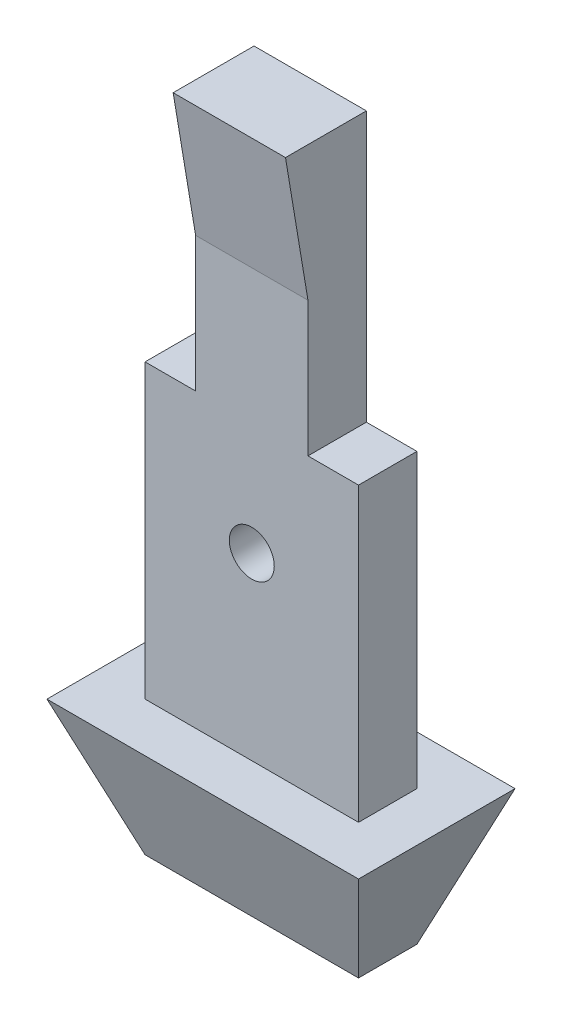
ISO-10303-21;
HEADER;
FILE_DESCRIPTION(('STEP AP214'),'2;1');
FILE_NAME('part.step','',(''),(''),'','','');
FILE_SCHEMA(('AUTOMOTIVE_DESIGN { 1 0 10303 214 1 1 1 1 }'));
ENDSEC;
DATA;
#1=APPLICATION_CONTEXT('core data for automotive mechanical design processes');
#2=APPLICATION_PROTOCOL_DEFINITION('international standard','automotive_design',2000,#1);
#3=PRODUCT_CONTEXT('',#1,'mechanical');
#4=PRODUCT('Part','Part','',(#3));
#5=PRODUCT_RELATED_PRODUCT_CATEGORY('part','',(#4));
#6=PRODUCT_DEFINITION_FORMATION('','',#4);
#7=PRODUCT_DEFINITION_CONTEXT('part definition',#1,'design');
#8=PRODUCT_DEFINITION('design','',#6,#7);
#9=PRODUCT_DEFINITION_SHAPE('','',#8);
#10=(LENGTH_UNIT() NAMED_UNIT(*) SI_UNIT(.MILLI.,.METRE.));
#11=(NAMED_UNIT(*) PLANE_ANGLE_UNIT() SI_UNIT($,.RADIAN.));
#12=(NAMED_UNIT(*) SI_UNIT($,.STERADIAN.) SOLID_ANGLE_UNIT());
#13=UNCERTAINTY_MEASURE_WITH_UNIT(LENGTH_MEASURE(1.E-05),#10,'distance_accuracy_value','');
#14=(GEOMETRIC_REPRESENTATION_CONTEXT(3) GLOBAL_UNCERTAINTY_ASSIGNED_CONTEXT((#13)) GLOBAL_UNIT_ASSIGNED_CONTEXT((#10,
#11,#12)) REPRESENTATION_CONTEXT('',''));
#15=CARTESIAN_POINT('',(0.,0.,0.));
#16=DIRECTION('',(0.,0.,1.));
#17=DIRECTION('',(1.,0.,0.));
#18=AXIS2_PLACEMENT_3D('',#15,#16,#17);
#19=CARTESIAN_POINT('',(0.,0.,2.6));
#20=DIRECTION('',(0.,0.,1.));
#21=DIRECTION('',(1.,0.,0.));
#22=AXIS2_PLACEMENT_3D('',#19,#20,#21);
#23=PLANE('',#22);
#24=DIRECTION('',(1.,0.,0.));
#25=VECTOR('',#24,1.);
#26=CARTESIAN_POINT('',(-8.58276253029822,25.,2.6));
#27=LINE('',#26,#25);
#28=CARTESIAN_POINT('',(-2.5,25.,2.6));
#29=VERTEX_POINT('',#28);
#30=CARTESIAN_POINT('',(2.5,25.,2.6));
#31=VERTEX_POINT('',#30);
#32=EDGE_CURVE('E146',#29,#31,#27,.T.);
#33=ORIENTED_EDGE('',*,*,#32,.F.);
#34=DIRECTION('',(0.,-1.,0.));
#35=VECTOR('',#34,1.);
#36=CARTESIAN_POINT('',(-2.5,31.,2.6));
#37=LINE('',#36,#35);
#38=CARTESIAN_POINT('',(-2.5,19.,2.6));
#39=VERTEX_POINT('',#38);
#40=EDGE_CURVE('E192',#29,#39,#37,.T.);
#41=ORIENTED_EDGE('',*,*,#40,.T.);
#42=DIRECTION('',(-1.,0.,0.));
#43=VECTOR('',#42,1.);
#44=CARTESIAN_POINT('',(-2.5,19.,2.6));
#45=LINE('',#44,#43);
#46=CARTESIAN_POINT('',(-4.75,19.,2.6));
#47=VERTEX_POINT('',#46);
#48=EDGE_CURVE('E195',#39,#47,#45,.T.);
#49=ORIENTED_EDGE('',*,*,#48,.T.);
#50=DIRECTION('',(0.,-1.,0.));
#51=VECTOR('',#50,1.);
#52=CARTESIAN_POINT('',(-4.75,19.,2.6));
#53=LINE('',#52,#51);
#54=CARTESIAN_POINT('',(-4.75,6.,2.6));
#55=VERTEX_POINT('',#54);
#56=EDGE_CURVE('E197',#47,#55,#53,.T.);
#57=ORIENTED_EDGE('',*,*,#56,.T.);
#58=DIRECTION('',(1.,0.,0.));
#59=VECTOR('',#58,1.);
#60=CARTESIAN_POINT('',(0.,6.,2.6));
#61=LINE('',#60,#59);
#62=CARTESIAN_POINT('',(4.75,6.,2.6));
#63=VERTEX_POINT('',#62);
#64=EDGE_CURVE('E181',#55,#63,#61,.T.);
#65=ORIENTED_EDGE('',*,*,#64,.T.);
#66=DIRECTION('',(0.,1.,0.));
#67=VECTOR('',#66,1.);
#68=CARTESIAN_POINT('',(4.75,19.,2.6));
#69=LINE('',#68,#67);
#70=CARTESIAN_POINT('',(4.75,19.,2.6));
#71=VERTEX_POINT('',#70);
#72=EDGE_CURVE('E202',#63,#71,#69,.T.);
#73=ORIENTED_EDGE('',*,*,#72,.T.);
#74=DIRECTION('',(-1.,0.,0.));
#75=VECTOR('',#74,1.);
#76=CARTESIAN_POINT('',(2.5,19.,2.6));
#77=LINE('',#76,#75);
#78=CARTESIAN_POINT('',(2.5,19.,2.6));
#79=VERTEX_POINT('',#78);
#80=EDGE_CURVE('E204',#71,#79,#77,.T.);
#81=ORIENTED_EDGE('',*,*,#80,.T.);
#82=DIRECTION('',(0.,1.,0.));
#83=VECTOR('',#82,1.);
#84=CARTESIAN_POINT('',(2.5,31.,2.6));
#85=LINE('',#84,#83);
#86=EDGE_CURVE('E47',#79,#31,#85,.T.);
#87=ORIENTED_EDGE('',*,*,#86,.T.);
#88=EDGE_LOOP('',(#33,#41,#49,#57,#65,#73,#81,#87));
#89=FACE_BOUND('',#88,.T.);
#90=CARTESIAN_POINT('',(0.,14.,2.6));
#91=DIRECTION('',(0.,0.,1.));
#92=DIRECTION('',(1.,0.,0.));
#93=AXIS2_PLACEMENT_3D('',#90,#91,#92);
#94=CIRCLE('',#93,1.);
#95=CARTESIAN_POINT('',(1.,14.,2.6));
#96=VERTEX_POINT('',#95);
#97=EDGE_CURVE('E186',#96,#96,#94,.T.);
#98=ORIENTED_EDGE('',*,*,#97,.F.);
#99=EDGE_LOOP('',(#98));
#100=FACE_BOUND('',#99,.T.);
#101=ADVANCED_FACE('F32',(#89,#100),#23,.T.);
#102=CARTESIAN_POINT('',(0.,0.,0.));
#103=DIRECTION('',(0.,0.,1.));
#104=DIRECTION('',(1.,0.,0.));
#105=AXIS2_PLACEMENT_3D('',#102,#103,#104);
#106=PLANE('',#105);
#107=CARTESIAN_POINT('',(0.,14.,0.));
#108=DIRECTION('',(0.,0.,1.));
#109=DIRECTION('',(1.,0.,0.));
#110=AXIS2_PLACEMENT_3D('',#107,#108,#109);
#111=CIRCLE('',#110,1.);
#112=CARTESIAN_POINT('',(1.,14.,0.));
#113=VERTEX_POINT('',#112);
#114=EDGE_CURVE('E185',#113,#113,#111,.T.);
#115=ORIENTED_EDGE('',*,*,#114,.T.);
#116=EDGE_LOOP('',(#115));
#117=FACE_BOUND('',#116,.T.);
#118=DIRECTION('',(1.,0.,0.));
#119=VECTOR('',#118,1.);
#120=CARTESIAN_POINT('',(0.,6.,0.));
#121=LINE('',#120,#119);
#122=CARTESIAN_POINT('',(-4.75,6.,0.));
#123=VERTEX_POINT('',#122);
#124=CARTESIAN_POINT('',(4.75,6.,0.));
#125=VERTEX_POINT('',#124);
#126=EDGE_CURVE('E157',#123,#125,#121,.T.);
#127=ORIENTED_EDGE('',*,*,#126,.F.);
#128=DIRECTION('',(0.,-1.,0.));
#129=VECTOR('',#128,1.);
#130=CARTESIAN_POINT('',(-4.75,19.,0.));
#131=LINE('',#130,#129);
#132=CARTESIAN_POINT('',(-4.75,19.,0.));
#133=VERTEX_POINT('',#132);
#134=EDGE_CURVE('E214',#133,#123,#131,.T.);
#135=ORIENTED_EDGE('',*,*,#134,.F.);
#136=DIRECTION('',(-1.,0.,0.));
#137=VECTOR('',#136,1.);
#138=CARTESIAN_POINT('',(-2.5,19.,0.));
#139=LINE('',#138,#137);
#140=CARTESIAN_POINT('',(-2.5,19.,0.));
#141=VERTEX_POINT('',#140);
#142=EDGE_CURVE('E212',#141,#133,#139,.T.);
#143=ORIENTED_EDGE('',*,*,#142,.F.);
#144=DIRECTION('',(0.,-1.,0.));
#145=VECTOR('',#144,1.);
#146=CARTESIAN_POINT('',(-2.5,31.,0.));
#147=LINE('',#146,#145);
#148=CARTESIAN_POINT('',(-2.5,31.,0.));
#149=VERTEX_POINT('',#148);
#150=EDGE_CURVE('E210',#149,#141,#147,.T.);
#151=ORIENTED_EDGE('',*,*,#150,.F.);
#152=DIRECTION('',(-1.,0.,0.));
#153=VECTOR('',#152,1.);
#154=CARTESIAN_POINT('',(-2.5,31.,0.));
#155=LINE('',#154,#153);
#156=CARTESIAN_POINT('',(2.5,31.,0.));
#157=VERTEX_POINT('',#156);
#158=EDGE_CURVE('E208',#157,#149,#155,.T.);
#159=ORIENTED_EDGE('',*,*,#158,.F.);
#160=DIRECTION('',(0.,1.,0.));
#161=VECTOR('',#160,1.);
#162=CARTESIAN_POINT('',(2.5,31.,0.));
#163=LINE('',#162,#161);
#164=CARTESIAN_POINT('',(2.5,19.,0.));
#165=VERTEX_POINT('',#164);
#166=EDGE_CURVE('E136',#165,#157,#163,.T.);
#167=ORIENTED_EDGE('',*,*,#166,.F.);
#168=DIRECTION('',(-1.,0.,0.));
#169=VECTOR('',#168,1.);
#170=CARTESIAN_POINT('',(2.5,19.,0.));
#171=LINE('',#170,#169);
#172=CARTESIAN_POINT('',(4.75,19.,0.));
#173=VERTEX_POINT('',#172);
#174=EDGE_CURVE('E193',#173,#165,#171,.T.);
#175=ORIENTED_EDGE('',*,*,#174,.F.);
#176=DIRECTION('',(0.,1.,0.));
#177=VECTOR('',#176,1.);
#178=CARTESIAN_POINT('',(4.75,19.,0.));
#179=LINE('',#178,#177);
#180=EDGE_CURVE('E218',#125,#173,#179,.T.);
#181=ORIENTED_EDGE('',*,*,#180,.F.);
#182=EDGE_LOOP('',(#127,#135,#143,#151,#159,#167,#175,#181));
#183=FACE_BOUND('',#182,.T.);
#184=ADVANCED_FACE('F242',(#117,#183),#106,.F.);
#185=CARTESIAN_POINT('',(-4.75,19.,2.6));
#186=DIRECTION('',(1.,0.,0.));
#187=DIRECTION('',(0.,1.,0.));
#188=AXIS2_PLACEMENT_3D('',#185,#186,#187);
#189=PLANE('',#188);
#190=DIRECTION('',(0.,0.,-1.));
#191=VECTOR('',#190,1.);
#192=CARTESIAN_POINT('',(-4.75,6.,2.6));
#193=LINE('',#192,#191);
#194=EDGE_CURVE('E55',#55,#123,#193,.T.);
#195=ORIENTED_EDGE('',*,*,#194,.F.);
#196=ORIENTED_EDGE('',*,*,#56,.F.);
#197=DIRECTION('',(0.,0.,-1.));
#198=VECTOR('',#197,1.);
#199=CARTESIAN_POINT('',(-4.75,19.,2.6));
#200=LINE('',#199,#198);
#201=EDGE_CURVE('E230',#47,#133,#200,.T.);
#202=ORIENTED_EDGE('',*,*,#201,.T.);
#203=ORIENTED_EDGE('',*,*,#134,.T.);
#204=EDGE_LOOP('',(#195,#196,#202,#203));
#205=FACE_BOUND('',#204,.T.);
#206=ADVANCED_FACE('F248',(#205),#189,.F.);
#207=CARTESIAN_POINT('',(4.75,19.,2.6));
#208=DIRECTION('',(-1.,0.,0.));
#209=DIRECTION('',(0.,-1.,0.));
#210=AXIS2_PLACEMENT_3D('',#207,#208,#209);
#211=PLANE('',#210);
#212=DIRECTION('',(0.,0.,1.));
#213=VECTOR('',#212,1.);
#214=CARTESIAN_POINT('',(4.75,6.,2.6));
#215=LINE('',#214,#213);
#216=EDGE_CURVE('E11',#125,#63,#215,.T.);
#217=ORIENTED_EDGE('',*,*,#216,.F.);
#218=ORIENTED_EDGE('',*,*,#180,.T.);
#219=DIRECTION('',(0.,0.,-1.));
#220=VECTOR('',#219,1.);
#221=CARTESIAN_POINT('',(4.75,19.,2.6));
#222=LINE('',#221,#220);
#223=EDGE_CURVE('E222',#71,#173,#222,.T.);
#224=ORIENTED_EDGE('',*,*,#223,.F.);
#225=ORIENTED_EDGE('',*,*,#72,.F.);
#226=EDGE_LOOP('',(#217,#218,#224,#225));
#227=FACE_BOUND('',#226,.T.);
#228=ADVANCED_FACE('F255',(#227),#211,.F.);
#229=CARTESIAN_POINT('',(2.5,31.,2.6));
#230=DIRECTION('',(-1.,0.,0.));
#231=DIRECTION('',(0.,-1.,0.));
#232=AXIS2_PLACEMENT_3D('',#229,#230,#231);
#233=PLANE('',#232);
#234=ORIENTED_EDGE('',*,*,#166,.T.);
#235=DIRECTION('',(0.,0.,-1.));
#236=VECTOR('',#235,1.);
#237=CARTESIAN_POINT('',(2.5,31.,2.6));
#238=LINE('',#237,#236);
#239=CARTESIAN_POINT('',(2.49999999999999,31.,3.6));
#240=VERTEX_POINT('',#239);
#241=EDGE_CURVE('E40',#240,#157,#238,.T.);
#242=ORIENTED_EDGE('',*,*,#241,.F.);
#243=DIRECTION('',(0.,-0.986393923832144,-0.164398987305357));
#244=VECTOR('',#243,1.);
#245=CARTESIAN_POINT('',(2.49999999999999,31.,3.6));
#246=LINE('',#245,#244);
#247=EDGE_CURVE('E133',#240,#31,#246,.T.);
#248=ORIENTED_EDGE('',*,*,#247,.T.);
#249=ORIENTED_EDGE('',*,*,#86,.F.);
#250=DIRECTION('',(0.,0.,-1.));
#251=VECTOR('',#250,1.);
#252=CARTESIAN_POINT('',(2.5,19.,2.6));
#253=LINE('',#252,#251);
#254=EDGE_CURVE('E206',#79,#165,#253,.T.);
#255=ORIENTED_EDGE('',*,*,#254,.T.);
#256=EDGE_LOOP('',(#234,#242,#248,#249,#255));
#257=FACE_BOUND('',#256,.T.);
#258=ADVANCED_FACE('F34',(#257),#233,.F.);
#259=CARTESIAN_POINT('',(-2.5,31.,2.6));
#260=DIRECTION('',(0.,-1.,0.));
#261=DIRECTION('',(0.,0.,-1.));
#262=AXIS2_PLACEMENT_3D('',#259,#260,#261);
#263=PLANE('',#262);
#264=ORIENTED_EDGE('',*,*,#158,.T.);
#265=DIRECTION('',(0.,0.,-1.));
#266=VECTOR('',#265,1.);
#267=CARTESIAN_POINT('',(-2.5,31.,2.6));
#268=LINE('',#267,#266);
#269=CARTESIAN_POINT('',(-2.5,31.,3.6));
#270=VERTEX_POINT('',#269);
#271=EDGE_CURVE('E138',#270,#149,#268,.T.);
#272=ORIENTED_EDGE('',*,*,#271,.F.);
#273=DIRECTION('',(1.,0.,0.));
#274=VECTOR('',#273,1.);
#275=CARTESIAN_POINT('',(-8.58276253029822,31.,3.6));
#276=LINE('',#275,#274);
#277=EDGE_CURVE('E140',#270,#240,#276,.T.);
#278=ORIENTED_EDGE('',*,*,#277,.T.);
#279=ORIENTED_EDGE('',*,*,#241,.T.);
#280=EDGE_LOOP('',(#264,#272,#278,#279));
#281=FACE_BOUND('',#280,.T.);
#282=ADVANCED_FACE('F141',(#281),#263,.F.);
#283=CARTESIAN_POINT('',(-2.5,31.,2.6));
#284=DIRECTION('',(1.,0.,0.));
#285=DIRECTION('',(0.,1.,0.));
#286=AXIS2_PLACEMENT_3D('',#283,#284,#285);
#287=PLANE('',#286);
#288=ORIENTED_EDGE('',*,*,#150,.T.);
#289=DIRECTION('',(0.,0.,-1.));
#290=VECTOR('',#289,1.);
#291=CARTESIAN_POINT('',(-2.5,19.,2.6));
#292=LINE('',#291,#290);
#293=EDGE_CURVE('E233',#39,#141,#292,.T.);
#294=ORIENTED_EDGE('',*,*,#293,.F.);
#295=ORIENTED_EDGE('',*,*,#40,.F.);
#296=DIRECTION('',(0.,0.986393923832144,0.164398987305357));
#297=VECTOR('',#296,1.);
#298=CARTESIAN_POINT('',(-2.5,31.,3.6));
#299=LINE('',#298,#297);
#300=EDGE_CURVE('E152',#29,#270,#299,.T.);
#301=ORIENTED_EDGE('',*,*,#300,.T.);
#302=ORIENTED_EDGE('',*,*,#271,.T.);
#303=EDGE_LOOP('',(#288,#294,#295,#301,#302));
#304=FACE_BOUND('',#303,.T.);
#305=ADVANCED_FACE('F238',(#304),#287,.F.);
#306=CARTESIAN_POINT('',(-2.5,19.,2.6));
#307=DIRECTION('',(0.,-1.,0.));
#308=DIRECTION('',(0.,0.,-1.));
#309=AXIS2_PLACEMENT_3D('',#306,#307,#308);
#310=PLANE('',#309);
#311=ORIENTED_EDGE('',*,*,#142,.T.);
#312=ORIENTED_EDGE('',*,*,#201,.F.);
#313=ORIENTED_EDGE('',*,*,#48,.F.);
#314=ORIENTED_EDGE('',*,*,#293,.T.);
#315=EDGE_LOOP('',(#311,#312,#313,#314));
#316=FACE_BOUND('',#315,.T.);
#317=ADVANCED_FACE('F246',(#316),#310,.F.);
#318=CARTESIAN_POINT('',(2.5,19.,2.6));
#319=DIRECTION('',(0.,-1.,0.));
#320=DIRECTION('',(0.,0.,-1.));
#321=AXIS2_PLACEMENT_3D('',#318,#319,#320);
#322=PLANE('',#321);
#323=ORIENTED_EDGE('',*,*,#174,.T.);
#324=ORIENTED_EDGE('',*,*,#254,.F.);
#325=ORIENTED_EDGE('',*,*,#80,.F.);
#326=ORIENTED_EDGE('',*,*,#223,.T.);
#327=EDGE_LOOP('',(#323,#324,#325,#326));
#328=FACE_BOUND('',#327,.T.);
#329=ADVANCED_FACE('F260',(#328),#322,.F.);
#330=CARTESIAN_POINT('',(0.,14.,2.6));
#331=DIRECTION('',(0.,0.,-1.));
#332=DIRECTION('',(-1.,0.,0.));
#333=AXIS2_PLACEMENT_3D('',#330,#331,#332);
#334=CYLINDRICAL_SURFACE('',#333,1.);
#335=ORIENTED_EDGE('',*,*,#97,.T.);
#336=EDGE_LOOP('',(#335));
#337=FACE_BOUND('',#336,.T.);
#338=ORIENTED_EDGE('',*,*,#114,.F.);
#339=EDGE_LOOP('',(#338));
#340=FACE_BOUND('',#339,.T.);
#341=ADVANCED_FACE('F263',(#337,#340),#334,.F.);
#342=CARTESIAN_POINT('',(0.,6.,0.));
#343=DIRECTION('',(0.,-1.,0.));
#344=DIRECTION('',(0.,0.,-1.));
#345=AXIS2_PLACEMENT_3D('',#342,#343,#344);
#346=PLANE('',#345);
#347=DIRECTION('',(0.,0.,-1.));
#348=VECTOR('',#347,1.);
#349=CARTESIAN_POINT('',(-6.93382140559722,6.,0.));
#350=LINE('',#349,#348);
#351=CARTESIAN_POINT('',(-6.93382140559722,6.,4.78382140559722));
#352=VERTEX_POINT('',#351);
#353=CARTESIAN_POINT('',(-6.93382140559722,6.,-2.18382140559722));
#354=VERTEX_POINT('',#353);
#355=EDGE_CURVE('E168',#352,#354,#350,.T.);
#356=ORIENTED_EDGE('',*,*,#355,.F.);
#357=DIRECTION('',(-1.,0.,0.));
#358=VECTOR('',#357,1.);
#359=CARTESIAN_POINT('',(0.,6.,4.78382140559722));
#360=LINE('',#359,#358);
#361=CARTESIAN_POINT('',(6.93382140559722,6.,4.78382140559722));
#362=VERTEX_POINT('',#361);
#363=EDGE_CURVE('E163',#362,#352,#360,.T.);
#364=ORIENTED_EDGE('',*,*,#363,.F.);
#365=DIRECTION('',(0.,0.,1.));
#366=VECTOR('',#365,1.);
#367=CARTESIAN_POINT('',(6.93382140559722,6.,0.));
#368=LINE('',#367,#366);
#369=CARTESIAN_POINT('',(6.93382140559722,6.,-2.18382140559722));
#370=VERTEX_POINT('',#369);
#371=EDGE_CURVE('E174',#370,#362,#368,.T.);
#372=ORIENTED_EDGE('',*,*,#371,.F.);
#373=DIRECTION('',(1.,0.,0.));
#374=VECTOR('',#373,1.);
#375=CARTESIAN_POINT('',(0.,6.,-2.18382140559722));
#376=LINE('',#375,#374);
#377=EDGE_CURVE('E171',#354,#370,#376,.T.);
#378=ORIENTED_EDGE('',*,*,#377,.F.);
#379=EDGE_LOOP('',(#356,#364,#372,#378));
#380=FACE_BOUND('',#379,.T.);
#381=ORIENTED_EDGE('',*,*,#64,.F.);
#382=ORIENTED_EDGE('',*,*,#194,.T.);
#383=ORIENTED_EDGE('',*,*,#126,.T.);
#384=ORIENTED_EDGE('',*,*,#216,.T.);
#385=EDGE_LOOP('',(#381,#382,#383,#384));
#386=FACE_BOUND('',#385,.T.);
#387=ADVANCED_FACE('F252',(#380,#386),#346,.F.);
#388=CARTESIAN_POINT('',(-4.75,0.,2.6));
#389=DIRECTION('',(-0.939692620785908,-0.342020143325669,0.));
#390=DIRECTION('',(0.342020143325669,-0.939692620785908,0.));
#391=AXIS2_PLACEMENT_3D('',#388,#389,#390);
#392=PLANE('',#391);
#393=DIRECTION('',(0.,0.,-1.));
#394=VECTOR('',#393,1.);
#395=CARTESIAN_POINT('',(-4.75,0.,2.6));
#396=LINE('',#395,#394);
#397=CARTESIAN_POINT('',(-4.75,0.,2.6));
#398=VERTEX_POINT('',#397);
#399=CARTESIAN_POINT('',(-4.75,0.,0.));
#400=VERTEX_POINT('',#399);
#401=EDGE_CURVE('E228',#398,#400,#396,.T.);
#402=ORIENTED_EDGE('',*,*,#401,.F.);
#403=DIRECTION('',(0.323615577118185,-0.889126490715988,-0.323615577118185));
#404=VECTOR('',#403,1.);
#405=CARTESIAN_POINT('',(-3.75509310334141,-2.73348423302915,1.60509310334141));
#406=LINE('',#405,#404);
#407=EDGE_CURVE('E154',#352,#398,#406,.T.);
#408=ORIENTED_EDGE('',*,*,#407,.F.);
#409=ORIENTED_EDGE('',*,*,#355,.T.);
#410=DIRECTION('',(0.323615577118185,-0.889126490715988,0.323615577118185));
#411=VECTOR('',#410,1.);
#412=CARTESIAN_POINT('',(-4.47770969144081,-0.748111474302715,0.272290308559194));
#413=LINE('',#412,#411);
#414=EDGE_CURVE('E159',#354,#400,#413,.T.);
#415=ORIENTED_EDGE('',*,*,#414,.T.);
#416=EDGE_LOOP('',(#402,#408,#409,#415));
#417=FACE_BOUND('',#416,.T.);
#418=ADVANCED_FACE('F285',(#417),#392,.T.);
#419=CARTESIAN_POINT('',(4.75,0.,2.6));
#420=DIRECTION('',(0.,-0.342020143325669,0.939692620785908));
#421=DIRECTION('',(0.,-0.939692620785908,-0.342020143325669));
#422=AXIS2_PLACEMENT_3D('',#419,#420,#421);
#423=PLANE('',#422);
#424=DIRECTION('',(1.,0.,0.));
#425=VECTOR('',#424,1.);
#426=CARTESIAN_POINT('',(4.75,0.,2.6));
#427=LINE('',#426,#425);
#428=CARTESIAN_POINT('',(4.75,0.,2.6));
#429=VERTEX_POINT('',#428);
#430=EDGE_CURVE('E199',#398,#429,#427,.T.);
#431=ORIENTED_EDGE('',*,*,#430,.T.);
#432=DIRECTION('',(-0.323615577118185,-0.889126490715988,-0.323615577118185));
#433=VECTOR('',#432,1.);
#434=CARTESIAN_POINT('',(4.47770969144081,-0.748111474302715,2.32770969144081));
#435=LINE('',#434,#433);
#436=EDGE_CURVE('E158',#362,#429,#435,.T.);
#437=ORIENTED_EDGE('',*,*,#436,.F.);
#438=ORIENTED_EDGE('',*,*,#363,.T.);
#439=ORIENTED_EDGE('',*,*,#407,.T.);
#440=EDGE_LOOP('',(#431,#437,#438,#439));
#441=FACE_BOUND('',#440,.T.);
#442=ADVANCED_FACE('F281',(#441),#423,.T.);
#443=CARTESIAN_POINT('',(4.75,0.,0.));
#444=DIRECTION('',(0.939692620785908,-0.342020143325669,0.));
#445=DIRECTION('',(0.342020143325669,0.939692620785908,0.));
#446=AXIS2_PLACEMENT_3D('',#443,#444,#445);
#447=PLANE('',#446);
#448=DIRECTION('',(0.,0.,-1.));
#449=VECTOR('',#448,1.);
#450=CARTESIAN_POINT('',(4.75,0.,2.6));
#451=LINE('',#450,#449);
#452=CARTESIAN_POINT('',(4.75,0.,0.));
#453=VERTEX_POINT('',#452);
#454=EDGE_CURVE('E225',#429,#453,#451,.T.);
#455=ORIENTED_EDGE('',*,*,#454,.T.);
#456=DIRECTION('',(-0.323615577118185,-0.889126490715988,0.323615577118185));
#457=VECTOR('',#456,1.);
#458=CARTESIAN_POINT('',(3.75509310334141,-2.73348423302915,0.994906896658594));
#459=LINE('',#458,#457);
#460=EDGE_CURVE('E162',#370,#453,#459,.T.);
#461=ORIENTED_EDGE('',*,*,#460,.F.);
#462=ORIENTED_EDGE('',*,*,#371,.T.);
#463=ORIENTED_EDGE('',*,*,#436,.T.);
#464=EDGE_LOOP('',(#455,#461,#462,#463));
#465=FACE_BOUND('',#464,.T.);
#466=ADVANCED_FACE('F284',(#465),#447,.T.);
#467=CARTESIAN_POINT('',(-4.75,0.,0.));
#468=DIRECTION('',(0.,-0.342020143325669,-0.939692620785908));
#469=DIRECTION('',(0.,0.939692620785908,-0.342020143325669));
#470=AXIS2_PLACEMENT_3D('',#467,#468,#469);
#471=PLANE('',#470);
#472=DIRECTION('',(1.,0.,0.));
#473=VECTOR('',#472,1.);
#474=CARTESIAN_POINT('',(4.75,0.,0.));
#475=LINE('',#474,#473);
#476=EDGE_CURVE('E216',#400,#453,#475,.T.);
#477=ORIENTED_EDGE('',*,*,#476,.F.);
#478=ORIENTED_EDGE('',*,*,#414,.F.);
#479=ORIENTED_EDGE('',*,*,#377,.T.);
#480=ORIENTED_EDGE('',*,*,#460,.T.);
#481=EDGE_LOOP('',(#477,#478,#479,#480));
#482=FACE_BOUND('',#481,.T.);
#483=ADVANCED_FACE('F289',(#482),#471,.T.);
#484=CARTESIAN_POINT('',(4.75,0.,2.6));
#485=DIRECTION('',(0.,1.,0.));
#486=DIRECTION('',(0.,0.,1.));
#487=AXIS2_PLACEMENT_3D('',#484,#485,#486);
#488=PLANE('',#487);
#489=ORIENTED_EDGE('',*,*,#476,.T.);
#490=ORIENTED_EDGE('',*,*,#454,.F.);
#491=ORIENTED_EDGE('',*,*,#430,.F.);
#492=ORIENTED_EDGE('',*,*,#401,.T.);
#493=EDGE_LOOP('',(#489,#490,#491,#492));
#494=FACE_BOUND('',#493,.T.);
#495=ADVANCED_FACE('F293',(#494),#488,.F.);
#496=CARTESIAN_POINT('',(-8.58276253029822,31.,3.6));
#497=DIRECTION('',(0.,-0.164398987305357,0.986393923832144));
#498=DIRECTION('',(0.,-0.986393923832144,-0.164398987305357));
#499=AXIS2_PLACEMENT_3D('',#496,#497,#498);
#500=PLANE('',#499);
#501=ORIENTED_EDGE('',*,*,#300,.F.);
#502=ORIENTED_EDGE('',*,*,#32,.T.);
#503=ORIENTED_EDGE('',*,*,#247,.F.);
#504=ORIENTED_EDGE('',*,*,#277,.F.);
#505=EDGE_LOOP('',(#501,#502,#503,#504));
#506=FACE_BOUND('',#505,.T.);
#507=ADVANCED_FACE('F148',(#506),#500,.T.);
#508=CLOSED_SHELL('',(#101,#184,#206,#228,#258,#282,#305,#317,#329,#341,#387,#418,#442,#466,
#483,#495,#507));
#509=MANIFOLD_SOLID_BREP('B2',#508);
#510=ADVANCED_BREP_SHAPE_REPRESENTATION('',(#18,#509),#14);
#511=SHAPE_DEFINITION_REPRESENTATION(#9,#510);
ENDSEC;
END-ISO-10303-21;
